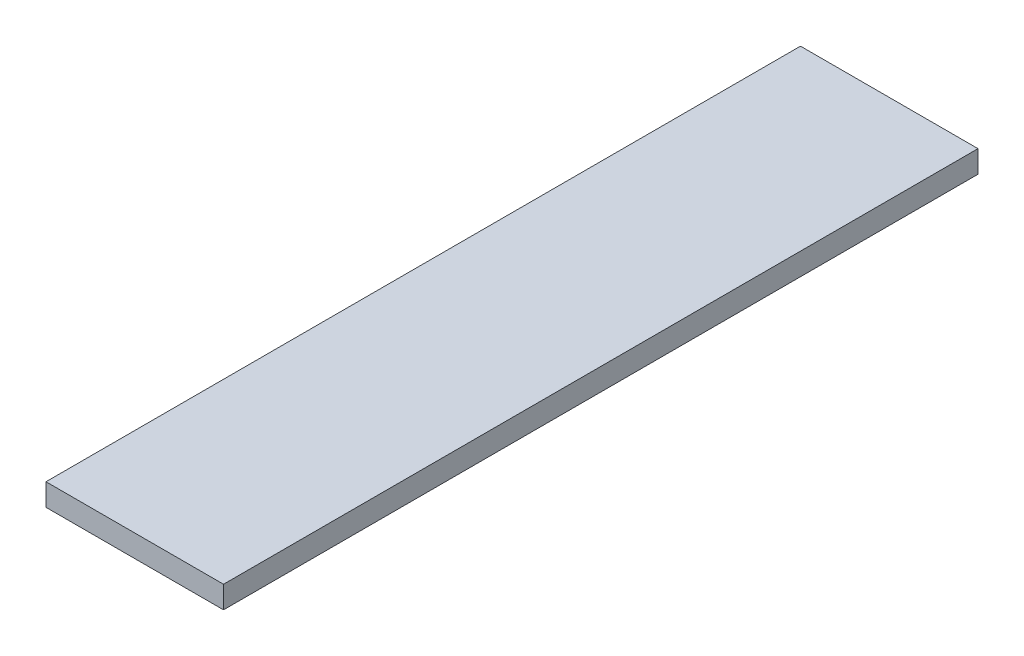
ISO-10303-21;
HEADER;
FILE_DESCRIPTION(('STEP AP214'),'2;1');
FILE_NAME('part.step','',(''),(''),'','','');
FILE_SCHEMA(('AUTOMOTIVE_DESIGN { 1 0 10303 214 1 1 1 1 }'));
ENDSEC;
DATA;
#1=APPLICATION_CONTEXT('core data for automotive mechanical design processes');
#2=APPLICATION_PROTOCOL_DEFINITION('international standard','automotive_design',2000,#1);
#3=PRODUCT_CONTEXT('',#1,'mechanical');
#4=PRODUCT('Part','Part','',(#3));
#5=PRODUCT_RELATED_PRODUCT_CATEGORY('part','',(#4));
#6=PRODUCT_DEFINITION_FORMATION('','',#4);
#7=PRODUCT_DEFINITION_CONTEXT('part definition',#1,'design');
#8=PRODUCT_DEFINITION('design','',#6,#7);
#9=PRODUCT_DEFINITION_SHAPE('','',#8);
#10=(LENGTH_UNIT() NAMED_UNIT(*) SI_UNIT(.MILLI.,.METRE.));
#11=(NAMED_UNIT(*) PLANE_ANGLE_UNIT() SI_UNIT($,.RADIAN.));
#12=(NAMED_UNIT(*) SI_UNIT($,.STERADIAN.) SOLID_ANGLE_UNIT());
#13=UNCERTAINTY_MEASURE_WITH_UNIT(LENGTH_MEASURE(1.E-05),#10,'distance_accuracy_value','');
#14=(GEOMETRIC_REPRESENTATION_CONTEXT(3) GLOBAL_UNCERTAINTY_ASSIGNED_CONTEXT((#13)) GLOBAL_UNIT_ASSIGNED_CONTEXT((#10,
#11,#12)) REPRESENTATION_CONTEXT('',''));
#15=CARTESIAN_POINT('',(0.,0.,0.));
#16=DIRECTION('',(0.,0.,1.));
#17=DIRECTION('',(1.,0.,0.));
#18=AXIS2_PLACEMENT_3D('',#15,#16,#17);
#19=CARTESIAN_POINT('',(0.,12.6999999999999,0.));
#20=DIRECTION('',(1.,0.,0.));
#21=DIRECTION('',(0.,0.,-1.));
#22=AXIS2_PLACEMENT_3D('',#19,#20,#21);
#23=PLANE('',#22);
#24=DIRECTION('',(0.,0.,1.));
#25=VECTOR('',#24,1.);
#26=CARTESIAN_POINT('',(0.,0.,0.));
#27=LINE('',#26,#25);
#28=CARTESIAN_POINT('',(0.,0.,-431.8));
#29=VERTEX_POINT('',#28);
#30=CARTESIAN_POINT('',(0.,0.,0.));
#31=VERTEX_POINT('',#30);
#32=EDGE_CURVE('E92',#29,#31,#27,.T.);
#33=ORIENTED_EDGE('',*,*,#32,.T.);
#34=DIRECTION('',(0.,-1.,0.));
#35=VECTOR('',#34,1.);
#36=CARTESIAN_POINT('',(0.,12.6999999999999,0.));
#37=LINE('',#36,#35);
#38=CARTESIAN_POINT('',(0.,12.6999999999999,0.));
#39=VERTEX_POINT('',#38);
#40=EDGE_CURVE('E11',#39,#31,#37,.T.);
#41=ORIENTED_EDGE('',*,*,#40,.F.);
#42=DIRECTION('',(0.,0.,1.));
#43=VECTOR('',#42,1.);
#44=CARTESIAN_POINT('',(0.,12.6999999999999,0.));
#45=LINE('',#44,#43);
#46=CARTESIAN_POINT('',(0.,12.6999999999999,-431.8));
#47=VERTEX_POINT('',#46);
#48=EDGE_CURVE('E80',#47,#39,#45,.T.);
#49=ORIENTED_EDGE('',*,*,#48,.F.);
#50=DIRECTION('',(0.,-1.,0.));
#51=VECTOR('',#50,1.);
#52=CARTESIAN_POINT('',(0.,12.6999999999999,-431.8));
#53=LINE('',#52,#51);
#54=EDGE_CURVE('E88',#47,#29,#53,.T.);
#55=ORIENTED_EDGE('',*,*,#54,.T.);
#56=EDGE_LOOP('',(#33,#41,#49,#55));
#57=FACE_BOUND('',#56,.T.);
#58=ADVANCED_FACE('F29',(#57),#23,.F.);
#59=CARTESIAN_POINT('',(0.,12.6999999999999,0.));
#60=DIRECTION('',(0.,0.,-1.));
#61=DIRECTION('',(-1.,0.,0.));
#62=AXIS2_PLACEMENT_3D('',#59,#60,#61);
#63=PLANE('',#62);
#64=DIRECTION('',(1.,0.,0.));
#65=VECTOR('',#64,1.);
#66=CARTESIAN_POINT('',(0.,0.,0.));
#67=LINE('',#66,#65);
#68=CARTESIAN_POINT('',(101.6,0.,0.));
#69=VERTEX_POINT('',#68);
#70=EDGE_CURVE('E84',#31,#69,#67,.T.);
#71=ORIENTED_EDGE('',*,*,#70,.T.);
#72=DIRECTION('',(0.,-1.,0.));
#73=VECTOR('',#72,1.);
#74=CARTESIAN_POINT('',(101.6,12.6999999999999,0.));
#75=LINE('',#74,#73);
#76=CARTESIAN_POINT('',(101.6,12.6999999999999,0.));
#77=VERTEX_POINT('',#76);
#78=EDGE_CURVE('E37',#77,#69,#75,.T.);
#79=ORIENTED_EDGE('',*,*,#78,.F.);
#80=DIRECTION('',(1.,0.,0.));
#81=VECTOR('',#80,1.);
#82=CARTESIAN_POINT('',(0.,12.6999999999999,0.));
#83=LINE('',#82,#81);
#84=EDGE_CURVE('E75',#39,#77,#83,.T.);
#85=ORIENTED_EDGE('',*,*,#84,.F.);
#86=ORIENTED_EDGE('',*,*,#40,.T.);
#87=EDGE_LOOP('',(#71,#79,#85,#86));
#88=FACE_BOUND('',#87,.T.);
#89=ADVANCED_FACE('F83',(#88),#63,.F.);
#90=CARTESIAN_POINT('',(101.6,12.6999999999999,0.));
#91=DIRECTION('',(-1.,0.,0.));
#92=DIRECTION('',(0.,0.,1.));
#93=AXIS2_PLACEMENT_3D('',#90,#91,#92);
#94=PLANE('',#93);
#95=DIRECTION('',(0.,0.,-1.));
#96=VECTOR('',#95,1.);
#97=CARTESIAN_POINT('',(101.6,0.,0.));
#98=LINE('',#97,#96);
#99=CARTESIAN_POINT('',(101.6,0.,-431.8));
#100=VERTEX_POINT('',#99);
#101=EDGE_CURVE('E62',#69,#100,#98,.T.);
#102=ORIENTED_EDGE('',*,*,#101,.T.);
#103=DIRECTION('',(0.,-1.,0.));
#104=VECTOR('',#103,1.);
#105=CARTESIAN_POINT('',(101.6,12.6999999999999,-431.8));
#106=LINE('',#105,#104);
#107=CARTESIAN_POINT('',(101.6,12.6999999999999,-431.8));
#108=VERTEX_POINT('',#107);
#109=EDGE_CURVE('E85',#108,#100,#106,.T.);
#110=ORIENTED_EDGE('',*,*,#109,.F.);
#111=DIRECTION('',(0.,0.,-1.));
#112=VECTOR('',#111,1.);
#113=CARTESIAN_POINT('',(101.6,12.6999999999999,0.));
#114=LINE('',#113,#112);
#115=EDGE_CURVE('E78',#77,#108,#114,.T.);
#116=ORIENTED_EDGE('',*,*,#115,.F.);
#117=ORIENTED_EDGE('',*,*,#78,.T.);
#118=EDGE_LOOP('',(#102,#110,#116,#117));
#119=FACE_BOUND('',#118,.T.);
#120=ADVANCED_FACE('F86',(#119),#94,.F.);
#121=CARTESIAN_POINT('',(0.,12.6999999999999,-431.8));
#122=DIRECTION('',(0.,0.,1.));
#123=DIRECTION('',(1.,0.,0.));
#124=AXIS2_PLACEMENT_3D('',#121,#122,#123);
#125=PLANE('',#124);
#126=DIRECTION('',(-1.,0.,0.));
#127=VECTOR('',#126,1.);
#128=CARTESIAN_POINT('',(0.,0.,-431.8));
#129=LINE('',#128,#127);
#130=EDGE_CURVE('E68',#100,#29,#129,.T.);
#131=ORIENTED_EDGE('',*,*,#130,.T.);
#132=ORIENTED_EDGE('',*,*,#54,.F.);
#133=DIRECTION('',(-1.,0.,0.));
#134=VECTOR('',#133,1.);
#135=CARTESIAN_POINT('',(0.,12.6999999999999,-431.8));
#136=LINE('',#135,#134);
#137=EDGE_CURVE('E45',#108,#47,#136,.T.);
#138=ORIENTED_EDGE('',*,*,#137,.F.);
#139=ORIENTED_EDGE('',*,*,#109,.T.);
#140=EDGE_LOOP('',(#131,#132,#138,#139));
#141=FACE_BOUND('',#140,.T.);
#142=ADVANCED_FACE('F99',(#141),#125,.F.);
#143=CARTESIAN_POINT('',(0.,12.6999999999999,0.));
#144=DIRECTION('',(0.,-1.,0.));
#145=DIRECTION('',(0.,0.,-1.));
#146=AXIS2_PLACEMENT_3D('',#143,#144,#145);
#147=PLANE('',#146);
#148=ORIENTED_EDGE('',*,*,#48,.T.);
#149=ORIENTED_EDGE('',*,*,#84,.T.);
#150=ORIENTED_EDGE('',*,*,#115,.T.);
#151=ORIENTED_EDGE('',*,*,#137,.T.);
#152=EDGE_LOOP('',(#148,#149,#150,#151));
#153=FACE_BOUND('',#152,.T.);
#154=ADVANCED_FACE('F76',(#153),#147,.F.);
#155=CARTESIAN_POINT('',(0.,0.,0.));
#156=DIRECTION('',(0.,-1.,0.));
#157=DIRECTION('',(0.,0.,-1.));
#158=AXIS2_PLACEMENT_3D('',#155,#156,#157);
#159=PLANE('',#158);
#160=ORIENTED_EDGE('',*,*,#32,.F.);
#161=ORIENTED_EDGE('',*,*,#130,.F.);
#162=ORIENTED_EDGE('',*,*,#101,.F.);
#163=ORIENTED_EDGE('',*,*,#70,.F.);
#164=EDGE_LOOP('',(#160,#161,#162,#163));
#165=FACE_BOUND('',#164,.T.);
#166=ADVANCED_FACE('F102',(#165),#159,.T.);
#167=CLOSED_SHELL('',(#58,#89,#120,#142,#154,#166));
#168=MANIFOLD_SOLID_BREP('B2',#167);
#169=ADVANCED_BREP_SHAPE_REPRESENTATION('',(#18,#168),#14);
#170=SHAPE_DEFINITION_REPRESENTATION(#9,#169);
ENDSEC;
END-ISO-10303-21;
